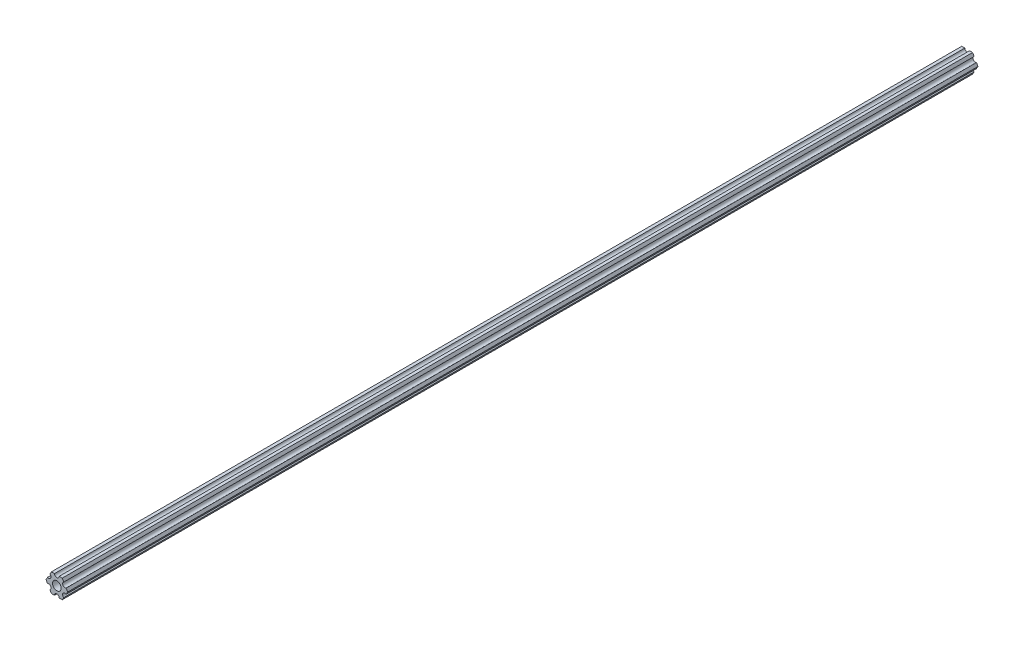
ISO-10303-21;
HEADER;
FILE_DESCRIPTION(('STEP AP214'),'2;1');
FILE_NAME('part.step','',(''),(''),'','','');
FILE_SCHEMA(('AUTOMOTIVE_DESIGN { 1 0 10303 214 1 1 1 1 }'));
ENDSEC;
DATA;
#1=APPLICATION_CONTEXT('core data for automotive mechanical design processes');
#2=APPLICATION_PROTOCOL_DEFINITION('international standard','automotive_design',2000,#1);
#3=PRODUCT_CONTEXT('',#1,'mechanical');
#4=PRODUCT('Part','Part','',(#3));
#5=PRODUCT_RELATED_PRODUCT_CATEGORY('part','',(#4));
#6=PRODUCT_DEFINITION_FORMATION('','',#4);
#7=PRODUCT_DEFINITION_CONTEXT('part definition',#1,'design');
#8=PRODUCT_DEFINITION('design','',#6,#7);
#9=PRODUCT_DEFINITION_SHAPE('','',#8);
#10=(LENGTH_UNIT() NAMED_UNIT(*) SI_UNIT(.MILLI.,.METRE.));
#11=(NAMED_UNIT(*) PLANE_ANGLE_UNIT() SI_UNIT($,.RADIAN.));
#12=(NAMED_UNIT(*) SI_UNIT($,.STERADIAN.) SOLID_ANGLE_UNIT());
#13=UNCERTAINTY_MEASURE_WITH_UNIT(LENGTH_MEASURE(1.E-05),#10,'distance_accuracy_value','');
#14=(GEOMETRIC_REPRESENTATION_CONTEXT(3) GLOBAL_UNCERTAINTY_ASSIGNED_CONTEXT((#13)) GLOBAL_UNIT_ASSIGNED_CONTEXT((#10,
#11,#12)) REPRESENTATION_CONTEXT('',''));
#15=CARTESIAN_POINT('',(0.,0.,0.));
#16=DIRECTION('',(0.,0.,1.));
#17=DIRECTION('',(1.,0.,0.));
#18=AXIS2_PLACEMENT_3D('',#15,#16,#17);
#19=CARTESIAN_POINT('',(1.58750000000001,-6.34999997712759,-615.95));
#20=DIRECTION('',(0.,-1.,0.));
#21=DIRECTION('',(0.,0.,-1.));
#22=AXIS2_PLACEMENT_3D('',#19,#20,#21);
#23=PLANE('',#22);
#24=DIRECTION('',(1.,0.,0.));
#25=VECTOR('',#24,1.);
#26=CARTESIAN_POINT('',(1.58750000000001,-6.34999997712759,0.));
#27=LINE('',#26,#25);
#28=CARTESIAN_POINT('',(1.58750000000001,-6.34999997712759,0.));
#29=VERTEX_POINT('',#28);
#30=CARTESIAN_POINT('',(3.66617417619055,-6.34999997712759,0.));
#31=VERTEX_POINT('',#30);
#32=EDGE_CURVE('E189',#29,#31,#27,.T.);
#33=ORIENTED_EDGE('',*,*,#32,.F.);
#34=DIRECTION('',(0.,0.,1.));
#35=VECTOR('',#34,1.);
#36=CARTESIAN_POINT('',(1.58750000000001,-6.34999997712759,-615.95));
#37=LINE('',#36,#35);
#38=CARTESIAN_POINT('',(1.58750000000001,-6.34999997712759,-615.95));
#39=VERTEX_POINT('',#38);
#40=EDGE_CURVE('E11',#39,#29,#37,.T.);
#41=ORIENTED_EDGE('',*,*,#40,.F.);
#42=DIRECTION('',(1.,0.,0.));
#43=VECTOR('',#42,1.);
#44=CARTESIAN_POINT('',(1.58750000000001,-6.34999997712759,-615.95));
#45=LINE('',#44,#43);
#46=CARTESIAN_POINT('',(3.66617417619055,-6.34999997712759,-615.95));
#47=VERTEX_POINT('',#46);
#48=EDGE_CURVE('E240',#39,#47,#45,.T.);
#49=ORIENTED_EDGE('',*,*,#48,.T.);
#50=DIRECTION('',(0.,0.,1.));
#51=VECTOR('',#50,1.);
#52=CARTESIAN_POINT('',(3.66617417619055,-6.34999997712759,-615.95));
#53=LINE('',#52,#51);
#54=EDGE_CURVE('E35',#47,#31,#53,.T.);
#55=ORIENTED_EDGE('',*,*,#54,.T.);
#56=EDGE_LOOP('',(#33,#41,#49,#55));
#57=FACE_BOUND('',#56,.T.);
#58=ADVANCED_FACE('F32',(#57),#23,.T.);
#59=CARTESIAN_POINT('',(0.,-6.34999997712759,-615.95));
#60=DIRECTION('',(0.,0.,1.));
#61=DIRECTION('',(1.,0.,0.));
#62=AXIS2_PLACEMENT_3D('',#59,#60,#61);
#63=CYLINDRICAL_SURFACE('',#62,1.58750000000001);
#64=CARTESIAN_POINT('',(0.,-6.34999997712759,0.));
#65=DIRECTION('',(0.,0.,-1.));
#66=DIRECTION('',(-1.,0.,0.));
#67=AXIS2_PLACEMENT_3D('',#64,#65,#66);
#68=CIRCLE('',#67,1.58750000000001);
#69=CARTESIAN_POINT('',(-1.58750000000001,-6.34999997712759,0.));
#70=VERTEX_POINT('',#69);
#71=EDGE_CURVE('E238',#70,#29,#68,.T.);
#72=ORIENTED_EDGE('',*,*,#71,.F.);
#73=DIRECTION('',(0.,0.,1.));
#74=VECTOR('',#73,1.);
#75=CARTESIAN_POINT('',(-1.58750000000001,-6.34999997712759,-615.95));
#76=LINE('',#75,#74);
#77=CARTESIAN_POINT('',(-1.58750000000001,-6.34999997712759,-615.95));
#78=VERTEX_POINT('',#77);
#79=EDGE_CURVE('E41',#78,#70,#76,.T.);
#80=ORIENTED_EDGE('',*,*,#79,.F.);
#81=CARTESIAN_POINT('',(0.,-6.34999997712759,-615.95));
#82=DIRECTION('',(0.,0.,-1.));
#83=DIRECTION('',(-1.,0.,0.));
#84=AXIS2_PLACEMENT_3D('',#81,#82,#83);
#85=CIRCLE('',#84,1.58750000000001);
#86=EDGE_CURVE('E179',#78,#39,#85,.T.);
#87=ORIENTED_EDGE('',*,*,#86,.T.);
#88=ORIENTED_EDGE('',*,*,#40,.T.);
#89=EDGE_LOOP('',(#72,#80,#87,#88));
#90=FACE_BOUND('',#89,.T.);
#91=ADVANCED_FACE('F272',(#90),#63,.F.);
#92=CARTESIAN_POINT('',(-3.66617417619055,-6.34999997712759,-615.95));
#93=DIRECTION('',(0.,-1.,0.));
#94=DIRECTION('',(0.,0.,-1.));
#95=AXIS2_PLACEMENT_3D('',#92,#93,#94);
#96=PLANE('',#95);
#97=DIRECTION('',(1.,0.,0.));
#98=VECTOR('',#97,1.);
#99=CARTESIAN_POINT('',(-3.66617417619055,-6.34999997712759,0.));
#100=LINE('',#99,#98);
#101=CARTESIAN_POINT('',(-3.66617417619055,-6.34999997712759,0.));
#102=VERTEX_POINT('',#101);
#103=EDGE_CURVE('E166',#102,#70,#100,.T.);
#104=ORIENTED_EDGE('',*,*,#103,.F.);
#105=DIRECTION('',(0.,0.,1.));
#106=VECTOR('',#105,1.);
#107=CARTESIAN_POINT('',(-3.66617417619055,-6.34999997712759,-615.95));
#108=LINE('',#107,#106);
#109=CARTESIAN_POINT('',(-3.66617417619055,-6.34999997712759,-615.95));
#110=VERTEX_POINT('',#109);
#111=EDGE_CURVE('E161',#110,#102,#108,.T.);
#112=ORIENTED_EDGE('',*,*,#111,.F.);
#113=DIRECTION('',(1.,0.,0.));
#114=VECTOR('',#113,1.);
#115=CARTESIAN_POINT('',(-3.66617417619055,-6.34999997712759,-615.95));
#116=LINE('',#115,#114);
#117=EDGE_CURVE('E164',#110,#78,#116,.T.);
#118=ORIENTED_EDGE('',*,*,#117,.T.);
#119=ORIENTED_EDGE('',*,*,#79,.T.);
#120=EDGE_LOOP('',(#104,#112,#118,#119));
#121=FACE_BOUND('',#120,.T.);
#122=ADVANCED_FACE('F163',(#121),#96,.T.);
#123=CARTESIAN_POINT('',(-4.70551124731177,-4.54981532455591,-615.95));
#124=DIRECTION('',(-0.866025408498969,-0.499999991834193,0.));
#125=DIRECTION('',(0.499999991834193,-0.866025408498969,0.));
#126=AXIS2_PLACEMENT_3D('',#123,#124,#125);
#127=PLANE('',#126);
#128=DIRECTION('',(0.499999991834193,-0.866025408498969,0.));
#129=VECTOR('',#128,1.);
#130=CARTESIAN_POINT('',(-4.70551124731177,-4.54981532455591,0.));
#131=LINE('',#130,#129);
#132=CARTESIAN_POINT('',(-4.70551124731177,-4.54981532455591,0.));
#133=VERTEX_POINT('',#132);
#134=EDGE_CURVE('E235',#133,#102,#131,.T.);
#135=ORIENTED_EDGE('',*,*,#134,.F.);
#136=DIRECTION('',(0.,0.,1.));
#137=VECTOR('',#136,1.);
#138=CARTESIAN_POINT('',(-4.70551124731177,-4.54981532455591,-615.95));
#139=LINE('',#138,#137);
#140=CARTESIAN_POINT('',(-4.70551124731177,-4.54981532455591,-615.95));
#141=VERTEX_POINT('',#140);
#142=EDGE_CURVE('E171',#141,#133,#139,.T.);
#143=ORIENTED_EDGE('',*,*,#142,.F.);
#144=DIRECTION('',(0.499999991834193,-0.866025408498969,0.));
#145=VECTOR('',#144,1.);
#146=CARTESIAN_POINT('',(-4.70551124731177,-4.54981532455591,-615.95));
#147=LINE('',#146,#145);
#148=EDGE_CURVE('E177',#141,#110,#147,.T.);
#149=ORIENTED_EDGE('',*,*,#148,.T.);
#150=ORIENTED_EDGE('',*,*,#111,.T.);
#151=EDGE_LOOP('',(#135,#143,#149,#150));
#152=FACE_BOUND('',#151,.T.);
#153=ADVANCED_FACE('F181',(#152),#127,.T.);
#154=CARTESIAN_POINT('',(-5.49926123434856,-3.17499998856379,-615.95));
#155=DIRECTION('',(0.,0.,1.));
#156=DIRECTION('',(1.,0.,0.));
#157=AXIS2_PLACEMENT_3D('',#154,#155,#156);
#158=CYLINDRICAL_SURFACE('',#157,1.58750000000001);
#159=CARTESIAN_POINT('',(-5.49926123434856,-3.17499998856379,0.));
#160=DIRECTION('',(0.,0.,-1.));
#161=DIRECTION('',(-1.,0.,0.));
#162=AXIS2_PLACEMENT_3D('',#159,#160,#161);
#163=CIRCLE('',#162,1.58750000000001);
#164=CARTESIAN_POINT('',(-6.29301122138534,-1.80018465257167,0.));
#165=VERTEX_POINT('',#164);
#166=EDGE_CURVE('E232',#165,#133,#163,.T.);
#167=ORIENTED_EDGE('',*,*,#166,.F.);
#168=DIRECTION('',(0.,0.,1.));
#169=VECTOR('',#168,1.);
#170=CARTESIAN_POINT('',(-6.29301122138534,-1.80018465257167,-615.95));
#171=LINE('',#170,#169);
#172=CARTESIAN_POINT('',(-6.29301122138534,-1.80018465257167,-615.95));
#173=VERTEX_POINT('',#172);
#174=EDGE_CURVE('E244',#173,#165,#171,.T.);
#175=ORIENTED_EDGE('',*,*,#174,.F.);
#176=CARTESIAN_POINT('',(-5.49926123434856,-3.17499998856379,-615.95));
#177=DIRECTION('',(0.,0.,-1.));
#178=DIRECTION('',(-1.,0.,0.));
#179=AXIS2_PLACEMENT_3D('',#176,#177,#178);
#180=CIRCLE('',#179,1.58750000000001);
#181=EDGE_CURVE('E182',#173,#141,#180,.T.);
#182=ORIENTED_EDGE('',*,*,#181,.T.);
#183=ORIENTED_EDGE('',*,*,#142,.T.);
#184=EDGE_LOOP('',(#167,#175,#182,#183));
#185=FACE_BOUND('',#184,.T.);
#186=ADVANCED_FACE('F285',(#185),#158,.F.);
#187=CARTESIAN_POINT('',(-7.33234829250656,0.,-615.95));
#188=DIRECTION('',(-0.866025408498969,-0.499999991834193,0.));
#189=DIRECTION('',(0.499999991834193,-0.866025408498969,0.));
#190=AXIS2_PLACEMENT_3D('',#187,#188,#189);
#191=PLANE('',#190);
#192=DIRECTION('',(0.499999991834193,-0.866025408498969,0.));
#193=VECTOR('',#192,1.);
#194=CARTESIAN_POINT('',(-7.33234829250656,0.,0.));
#195=LINE('',#194,#193);
#196=CARTESIAN_POINT('',(-7.33234829250656,0.,0.));
#197=VERTEX_POINT('',#196);
#198=EDGE_CURVE('E229',#197,#165,#195,.T.);
#199=ORIENTED_EDGE('',*,*,#198,.F.);
#200=DIRECTION('',(0.,0.,1.));
#201=VECTOR('',#200,1.);
#202=CARTESIAN_POINT('',(-7.33234829250656,0.,-615.95));
#203=LINE('',#202,#201);
#204=CARTESIAN_POINT('',(-7.33234829250656,0.,-615.95));
#205=VERTEX_POINT('',#204);
#206=EDGE_CURVE('E246',#205,#197,#203,.T.);
#207=ORIENTED_EDGE('',*,*,#206,.F.);
#208=DIRECTION('',(0.499999991834193,-0.866025408498969,0.));
#209=VECTOR('',#208,1.);
#210=CARTESIAN_POINT('',(-7.33234829250656,0.,-615.95));
#211=LINE('',#210,#209);
#212=EDGE_CURVE('E184',#205,#173,#211,.T.);
#213=ORIENTED_EDGE('',*,*,#212,.T.);
#214=ORIENTED_EDGE('',*,*,#174,.T.);
#215=EDGE_LOOP('',(#199,#207,#213,#214));
#216=FACE_BOUND('',#215,.T.);
#217=ADVANCED_FACE('F288',(#216),#191,.T.);
#218=CARTESIAN_POINT('',(-6.29301122138534,1.80018465257168,-615.95));
#219=DIRECTION('',(-0.86602540849897,0.499999991834193,0.));
#220=DIRECTION('',(-0.499999991834193,-0.86602540849897,0.));
#221=AXIS2_PLACEMENT_3D('',#218,#219,#220);
#222=PLANE('',#221);
#223=DIRECTION('',(-0.499999991834193,-0.866025408498969,0.));
#224=VECTOR('',#223,1.);
#225=CARTESIAN_POINT('',(-6.29301122138534,1.80018465257168,0.));
#226=LINE('',#225,#224);
#227=CARTESIAN_POINT('',(-6.29301122138534,1.80018465257168,0.));
#228=VERTEX_POINT('',#227);
#229=EDGE_CURVE('E226',#228,#197,#226,.T.);
#230=ORIENTED_EDGE('',*,*,#229,.F.);
#231=DIRECTION('',(0.,0.,1.));
#232=VECTOR('',#231,1.);
#233=CARTESIAN_POINT('',(-6.29301122138534,1.80018465257168,-615.95));
#234=LINE('',#233,#232);
#235=CARTESIAN_POINT('',(-6.29301122138534,1.80018465257168,-615.95));
#236=VERTEX_POINT('',#235);
#237=EDGE_CURVE('E248',#236,#228,#234,.T.);
#238=ORIENTED_EDGE('',*,*,#237,.F.);
#239=DIRECTION('',(-0.499999991834193,-0.866025408498969,0.));
#240=VECTOR('',#239,1.);
#241=CARTESIAN_POINT('',(-6.29301122138534,1.80018465257168,-615.95));
#242=LINE('',#241,#240);
#243=EDGE_CURVE('E393',#236,#205,#242,.T.);
#244=ORIENTED_EDGE('',*,*,#243,.T.);
#245=ORIENTED_EDGE('',*,*,#206,.T.);
#246=EDGE_LOOP('',(#230,#238,#244,#245));
#247=FACE_BOUND('',#246,.T.);
#248=ADVANCED_FACE('F292',(#247),#222,.T.);
#249=CARTESIAN_POINT('',(-5.49926123434856,3.1749999885638,-615.95));
#250=DIRECTION('',(0.,0.,1.));
#251=DIRECTION('',(1.,0.,0.));
#252=AXIS2_PLACEMENT_3D('',#249,#250,#251);
#253=CYLINDRICAL_SURFACE('',#252,1.58750000000001);
#254=CARTESIAN_POINT('',(-5.49926123434856,3.1749999885638,0.));
#255=DIRECTION('',(0.,0.,-1.));
#256=DIRECTION('',(-1.,0.,0.));
#257=AXIS2_PLACEMENT_3D('',#254,#255,#256);
#258=CIRCLE('',#257,1.58750000000001);
#259=CARTESIAN_POINT('',(-4.70551124731177,4.54981532455591,0.));
#260=VERTEX_POINT('',#259);
#261=EDGE_CURVE('E223',#260,#228,#258,.T.);
#262=ORIENTED_EDGE('',*,*,#261,.F.);
#263=DIRECTION('',(0.,0.,1.));
#264=VECTOR('',#263,1.);
#265=CARTESIAN_POINT('',(-4.70551124731177,4.54981532455591,-615.95));
#266=LINE('',#265,#264);
#267=CARTESIAN_POINT('',(-4.70551124731177,4.54981532455591,-615.95));
#268=VERTEX_POINT('',#267);
#269=EDGE_CURVE('E250',#268,#260,#266,.T.);
#270=ORIENTED_EDGE('',*,*,#269,.F.);
#271=CARTESIAN_POINT('',(-5.49926123434856,3.1749999885638,-615.95));
#272=DIRECTION('',(0.,0.,-1.));
#273=DIRECTION('',(-1.,0.,0.));
#274=AXIS2_PLACEMENT_3D('',#271,#272,#273);
#275=CIRCLE('',#274,1.58750000000001);
#276=EDGE_CURVE('E390',#268,#236,#275,.T.);
#277=ORIENTED_EDGE('',*,*,#276,.T.);
#278=ORIENTED_EDGE('',*,*,#237,.T.);
#279=EDGE_LOOP('',(#262,#270,#277,#278));
#280=FACE_BOUND('',#279,.T.);
#281=ADVANCED_FACE('F296',(#280),#253,.F.);
#282=CARTESIAN_POINT('',(-3.66617417619055,6.34999997712759,-615.95));
#283=DIRECTION('',(-0.866025408498969,0.499999991834193,0.));
#284=DIRECTION('',(-0.499999991834193,-0.86602540849897,0.));
#285=AXIS2_PLACEMENT_3D('',#282,#283,#284);
#286=PLANE('',#285);
#287=DIRECTION('',(-0.499999991834193,-0.866025408498969,0.));
#288=VECTOR('',#287,1.);
#289=CARTESIAN_POINT('',(-3.66617417619055,6.34999997712759,0.));
#290=LINE('',#289,#288);
#291=CARTESIAN_POINT('',(-3.66617417619055,6.34999997712759,0.));
#292=VERTEX_POINT('',#291);
#293=EDGE_CURVE('E220',#292,#260,#290,.T.);
#294=ORIENTED_EDGE('',*,*,#293,.F.);
#295=DIRECTION('',(0.,0.,1.));
#296=VECTOR('',#295,1.);
#297=CARTESIAN_POINT('',(-3.66617417619055,6.34999997712759,-615.95));
#298=LINE('',#297,#296);
#299=CARTESIAN_POINT('',(-3.66617417619055,6.34999997712759,-615.95));
#300=VERTEX_POINT('',#299);
#301=EDGE_CURVE('E252',#300,#292,#298,.T.);
#302=ORIENTED_EDGE('',*,*,#301,.F.);
#303=DIRECTION('',(-0.499999991834193,-0.866025408498969,0.));
#304=VECTOR('',#303,1.);
#305=CARTESIAN_POINT('',(-3.66617417619055,6.34999997712759,-615.95));
#306=LINE('',#305,#304);
#307=EDGE_CURVE('E387',#300,#268,#306,.T.);
#308=ORIENTED_EDGE('',*,*,#307,.T.);
#309=ORIENTED_EDGE('',*,*,#269,.T.);
#310=EDGE_LOOP('',(#294,#302,#308,#309));
#311=FACE_BOUND('',#310,.T.);
#312=ADVANCED_FACE('F300',(#311),#286,.T.);
#313=CARTESIAN_POINT('',(-1.58750000000001,6.34999997712759,-615.95));
#314=DIRECTION('',(0.,1.,0.));
#315=DIRECTION('',(0.,0.,1.));
#316=AXIS2_PLACEMENT_3D('',#313,#314,#315);
#317=PLANE('',#316);
#318=DIRECTION('',(-1.,0.,0.));
#319=VECTOR('',#318,1.);
#320=CARTESIAN_POINT('',(-1.58750000000001,6.34999997712759,0.));
#321=LINE('',#320,#319);
#322=CARTESIAN_POINT('',(-1.58750000000001,6.34999997712759,0.));
#323=VERTEX_POINT('',#322);
#324=EDGE_CURVE('E217',#323,#292,#321,.T.);
#325=ORIENTED_EDGE('',*,*,#324,.F.);
#326=DIRECTION('',(0.,0.,1.));
#327=VECTOR('',#326,1.);
#328=CARTESIAN_POINT('',(-1.58750000000001,6.34999997712759,-615.95));
#329=LINE('',#328,#327);
#330=CARTESIAN_POINT('',(-1.58750000000001,6.34999997712759,-615.95));
#331=VERTEX_POINT('',#330);
#332=EDGE_CURVE('E254',#331,#323,#329,.T.);
#333=ORIENTED_EDGE('',*,*,#332,.F.);
#334=DIRECTION('',(-1.,0.,0.));
#335=VECTOR('',#334,1.);
#336=CARTESIAN_POINT('',(-1.58750000000001,6.34999997712759,-615.95));
#337=LINE('',#336,#335);
#338=EDGE_CURVE('E384',#331,#300,#337,.T.);
#339=ORIENTED_EDGE('',*,*,#338,.T.);
#340=ORIENTED_EDGE('',*,*,#301,.T.);
#341=EDGE_LOOP('',(#325,#333,#339,#340));
#342=FACE_BOUND('',#341,.T.);
#343=ADVANCED_FACE('F304',(#342),#317,.T.);
#344=CARTESIAN_POINT('',(0.,6.34999997712759,-615.95));
#345=DIRECTION('',(0.,0.,1.));
#346=DIRECTION('',(1.,0.,0.));
#347=AXIS2_PLACEMENT_3D('',#344,#345,#346);
#348=CYLINDRICAL_SURFACE('',#347,1.58750000000001);
#349=CARTESIAN_POINT('',(0.,6.34999997712759,0.));
#350=DIRECTION('',(0.,0.,-1.));
#351=DIRECTION('',(-1.,0.,0.));
#352=AXIS2_PLACEMENT_3D('',#349,#350,#351);
#353=CIRCLE('',#352,1.58750000000001);
#354=CARTESIAN_POINT('',(1.58750000000001,6.34999997712759,0.));
#355=VERTEX_POINT('',#354);
#356=EDGE_CURVE('E214',#355,#323,#353,.T.);
#357=ORIENTED_EDGE('',*,*,#356,.F.);
#358=DIRECTION('',(0.,0.,1.));
#359=VECTOR('',#358,1.);
#360=CARTESIAN_POINT('',(1.58750000000001,6.34999997712759,-615.95));
#361=LINE('',#360,#359);
#362=CARTESIAN_POINT('',(1.58750000000001,6.34999997712759,-615.95));
#363=VERTEX_POINT('',#362);
#364=EDGE_CURVE('E256',#363,#355,#361,.T.);
#365=ORIENTED_EDGE('',*,*,#364,.F.);
#366=CARTESIAN_POINT('',(0.,6.34999997712759,-615.95));
#367=DIRECTION('',(0.,0.,-1.));
#368=DIRECTION('',(-1.,0.,0.));
#369=AXIS2_PLACEMENT_3D('',#366,#367,#368);
#370=CIRCLE('',#369,1.58750000000001);
#371=EDGE_CURVE('E381',#363,#331,#370,.T.);
#372=ORIENTED_EDGE('',*,*,#371,.T.);
#373=ORIENTED_EDGE('',*,*,#332,.T.);
#374=EDGE_LOOP('',(#357,#365,#372,#373));
#375=FACE_BOUND('',#374,.T.);
#376=ADVANCED_FACE('F308',(#375),#348,.F.);
#377=CARTESIAN_POINT('',(3.66617417619055,6.34999997712759,-615.95));
#378=DIRECTION('',(0.,1.,0.));
#379=DIRECTION('',(0.,0.,1.));
#380=AXIS2_PLACEMENT_3D('',#377,#378,#379);
#381=PLANE('',#380);
#382=DIRECTION('',(-1.,0.,0.));
#383=VECTOR('',#382,1.);
#384=CARTESIAN_POINT('',(3.66617417619055,6.34999997712759,0.));
#385=LINE('',#384,#383);
#386=CARTESIAN_POINT('',(3.66617417619055,6.34999997712759,0.));
#387=VERTEX_POINT('',#386);
#388=EDGE_CURVE('E211',#387,#355,#385,.T.);
#389=ORIENTED_EDGE('',*,*,#388,.F.);
#390=DIRECTION('',(0.,0.,1.));
#391=VECTOR('',#390,1.);
#392=CARTESIAN_POINT('',(3.66617417619055,6.34999997712759,-615.95));
#393=LINE('',#392,#391);
#394=CARTESIAN_POINT('',(3.66617417619055,6.34999997712759,-615.95));
#395=VERTEX_POINT('',#394);
#396=EDGE_CURVE('E258',#395,#387,#393,.T.);
#397=ORIENTED_EDGE('',*,*,#396,.F.);
#398=DIRECTION('',(-1.,0.,0.));
#399=VECTOR('',#398,1.);
#400=CARTESIAN_POINT('',(3.66617417619055,6.34999997712759,-615.95));
#401=LINE('',#400,#399);
#402=EDGE_CURVE('E378',#395,#363,#401,.T.);
#403=ORIENTED_EDGE('',*,*,#402,.T.);
#404=ORIENTED_EDGE('',*,*,#364,.T.);
#405=EDGE_LOOP('',(#389,#397,#403,#404));
#406=FACE_BOUND('',#405,.T.);
#407=ADVANCED_FACE('F312',(#406),#381,.T.);
#408=CARTESIAN_POINT('',(4.70551124731177,4.54981532455591,-615.95));
#409=DIRECTION('',(0.866025408498969,0.499999991834193,0.));
#410=DIRECTION('',(-0.499999991834193,0.86602540849897,0.));
#411=AXIS2_PLACEMENT_3D('',#408,#409,#410);
#412=PLANE('',#411);
#413=DIRECTION('',(-0.499999991834193,0.866025408498969,0.));
#414=VECTOR('',#413,1.);
#415=CARTESIAN_POINT('',(4.70551124731177,4.54981532455591,0.));
#416=LINE('',#415,#414);
#417=CARTESIAN_POINT('',(4.70551124731177,4.54981532455591,0.));
#418=VERTEX_POINT('',#417);
#419=EDGE_CURVE('E208',#418,#387,#416,.T.);
#420=ORIENTED_EDGE('',*,*,#419,.F.);
#421=DIRECTION('',(0.,0.,1.));
#422=VECTOR('',#421,1.);
#423=CARTESIAN_POINT('',(4.70551124731177,4.54981532455591,-615.95));
#424=LINE('',#423,#422);
#425=CARTESIAN_POINT('',(4.70551124731177,4.54981532455591,-615.95));
#426=VERTEX_POINT('',#425);
#427=EDGE_CURVE('E260',#426,#418,#424,.T.);
#428=ORIENTED_EDGE('',*,*,#427,.F.);
#429=DIRECTION('',(-0.499999991834193,0.866025408498969,0.));
#430=VECTOR('',#429,1.);
#431=CARTESIAN_POINT('',(4.70551124731177,4.54981532455591,-615.95));
#432=LINE('',#431,#430);
#433=EDGE_CURVE('E375',#426,#395,#432,.T.);
#434=ORIENTED_EDGE('',*,*,#433,.T.);
#435=ORIENTED_EDGE('',*,*,#396,.T.);
#436=EDGE_LOOP('',(#420,#428,#434,#435));
#437=FACE_BOUND('',#436,.T.);
#438=ADVANCED_FACE('F316',(#437),#412,.T.);
#439=CARTESIAN_POINT('',(5.49926123434856,3.1749999885638,-615.95));
#440=DIRECTION('',(0.,0.,1.));
#441=DIRECTION('',(1.,0.,0.));
#442=AXIS2_PLACEMENT_3D('',#439,#440,#441);
#443=CYLINDRICAL_SURFACE('',#442,1.58750000000001);
#444=CARTESIAN_POINT('',(5.49926123434856,3.1749999885638,0.));
#445=DIRECTION('',(0.,0.,-1.));
#446=DIRECTION('',(-1.,0.,0.));
#447=AXIS2_PLACEMENT_3D('',#444,#445,#446);
#448=CIRCLE('',#447,1.58750000000001);
#449=CARTESIAN_POINT('',(6.29301122138534,1.80018465257168,0.));
#450=VERTEX_POINT('',#449);
#451=EDGE_CURVE('E205',#450,#418,#448,.T.);
#452=ORIENTED_EDGE('',*,*,#451,.F.);
#453=DIRECTION('',(0.,0.,1.));
#454=VECTOR('',#453,1.);
#455=CARTESIAN_POINT('',(6.29301122138534,1.80018465257168,-615.95));
#456=LINE('',#455,#454);
#457=CARTESIAN_POINT('',(6.29301122138534,1.80018465257168,-615.95));
#458=VERTEX_POINT('',#457);
#459=EDGE_CURVE('E262',#458,#450,#456,.T.);
#460=ORIENTED_EDGE('',*,*,#459,.F.);
#461=CARTESIAN_POINT('',(5.49926123434856,3.1749999885638,-615.95));
#462=DIRECTION('',(0.,0.,-1.));
#463=DIRECTION('',(-1.,0.,0.));
#464=AXIS2_PLACEMENT_3D('',#461,#462,#463);
#465=CIRCLE('',#464,1.58750000000001);
#466=EDGE_CURVE('E372',#458,#426,#465,.T.);
#467=ORIENTED_EDGE('',*,*,#466,.T.);
#468=ORIENTED_EDGE('',*,*,#427,.T.);
#469=EDGE_LOOP('',(#452,#460,#467,#468));
#470=FACE_BOUND('',#469,.T.);
#471=ADVANCED_FACE('F320',(#470),#443,.F.);
#472=CARTESIAN_POINT('',(7.33234829250656,0.,-615.95));
#473=DIRECTION('',(0.86602540849897,0.499999991834193,0.));
#474=DIRECTION('',(-0.499999991834193,0.86602540849897,0.));
#475=AXIS2_PLACEMENT_3D('',#472,#473,#474);
#476=PLANE('',#475);
#477=DIRECTION('',(-0.499999991834193,0.866025408498969,0.));
#478=VECTOR('',#477,1.);
#479=CARTESIAN_POINT('',(7.33234829250656,0.,0.));
#480=LINE('',#479,#478);
#481=CARTESIAN_POINT('',(7.33234829250656,0.,0.));
#482=VERTEX_POINT('',#481);
#483=EDGE_CURVE('E202',#482,#450,#480,.T.);
#484=ORIENTED_EDGE('',*,*,#483,.F.);
#485=DIRECTION('',(0.,0.,1.));
#486=VECTOR('',#485,1.);
#487=CARTESIAN_POINT('',(7.33234829250656,0.,-615.95));
#488=LINE('',#487,#486);
#489=CARTESIAN_POINT('',(7.33234829250656,0.,-615.95));
#490=VERTEX_POINT('',#489);
#491=EDGE_CURVE('E264',#490,#482,#488,.T.);
#492=ORIENTED_EDGE('',*,*,#491,.F.);
#493=DIRECTION('',(-0.499999991834193,0.866025408498969,0.));
#494=VECTOR('',#493,1.);
#495=CARTESIAN_POINT('',(7.33234829250656,0.,-615.95));
#496=LINE('',#495,#494);
#497=EDGE_CURVE('E369',#490,#458,#496,.T.);
#498=ORIENTED_EDGE('',*,*,#497,.T.);
#499=ORIENTED_EDGE('',*,*,#459,.T.);
#500=EDGE_LOOP('',(#484,#492,#498,#499));
#501=FACE_BOUND('',#500,.T.);
#502=ADVANCED_FACE('F324',(#501),#476,.T.);
#503=CARTESIAN_POINT('',(6.29301122138534,-1.80018465257167,-615.95));
#504=DIRECTION('',(0.866025408498969,-0.499999991834193,0.));
#505=DIRECTION('',(0.499999991834193,0.866025408498969,0.));
#506=AXIS2_PLACEMENT_3D('',#503,#504,#505);
#507=PLANE('',#506);
#508=DIRECTION('',(0.499999991834193,0.866025408498969,0.));
#509=VECTOR('',#508,1.);
#510=CARTESIAN_POINT('',(6.29301122138534,-1.80018465257167,0.));
#511=LINE('',#510,#509);
#512=CARTESIAN_POINT('',(6.29301122138534,-1.80018465257168,0.));
#513=VERTEX_POINT('',#512);
#514=EDGE_CURVE('E199',#513,#482,#511,.T.);
#515=ORIENTED_EDGE('',*,*,#514,.F.);
#516=DIRECTION('',(0.,0.,1.));
#517=VECTOR('',#516,1.);
#518=CARTESIAN_POINT('',(6.29301122138534,-1.80018465257168,-615.95));
#519=LINE('',#518,#517);
#520=CARTESIAN_POINT('',(6.29301122138534,-1.80018465257168,-615.95));
#521=VERTEX_POINT('',#520);
#522=EDGE_CURVE('E266',#521,#513,#519,.T.);
#523=ORIENTED_EDGE('',*,*,#522,.F.);
#524=DIRECTION('',(0.499999991834193,0.866025408498969,0.));
#525=VECTOR('',#524,1.);
#526=CARTESIAN_POINT('',(6.29301122138534,-1.80018465257167,-615.95));
#527=LINE('',#526,#525);
#528=EDGE_CURVE('E366',#521,#490,#527,.T.);
#529=ORIENTED_EDGE('',*,*,#528,.T.);
#530=ORIENTED_EDGE('',*,*,#491,.T.);
#531=EDGE_LOOP('',(#515,#523,#529,#530));
#532=FACE_BOUND('',#531,.T.);
#533=ADVANCED_FACE('F328',(#532),#507,.T.);
#534=CARTESIAN_POINT('',(5.49926123434856,-3.17499998856379,-615.95));
#535=DIRECTION('',(0.,0.,1.));
#536=DIRECTION('',(1.,0.,0.));
#537=AXIS2_PLACEMENT_3D('',#534,#535,#536);
#538=CYLINDRICAL_SURFACE('',#537,1.58750000000001);
#539=CARTESIAN_POINT('',(5.49926123434856,-3.17499998856379,0.));
#540=DIRECTION('',(0.,0.,-1.));
#541=DIRECTION('',(-1.,0.,0.));
#542=AXIS2_PLACEMENT_3D('',#539,#540,#541);
#543=CIRCLE('',#542,1.58750000000001);
#544=CARTESIAN_POINT('',(4.70551124731177,-4.54981532455591,0.));
#545=VERTEX_POINT('',#544);
#546=EDGE_CURVE('E196',#545,#513,#543,.T.);
#547=ORIENTED_EDGE('',*,*,#546,.F.);
#548=DIRECTION('',(0.,0.,1.));
#549=VECTOR('',#548,1.);
#550=CARTESIAN_POINT('',(4.70551124731177,-4.54981532455591,-615.95));
#551=LINE('',#550,#549);
#552=CARTESIAN_POINT('',(4.70551124731177,-4.54981532455591,-615.95));
#553=VERTEX_POINT('',#552);
#554=EDGE_CURVE('E267',#553,#545,#551,.T.);
#555=ORIENTED_EDGE('',*,*,#554,.F.);
#556=CARTESIAN_POINT('',(5.49926123434856,-3.17499998856379,-615.95));
#557=DIRECTION('',(0.,0.,-1.));
#558=DIRECTION('',(-1.,0.,0.));
#559=AXIS2_PLACEMENT_3D('',#556,#557,#558);
#560=CIRCLE('',#559,1.58750000000001);
#561=EDGE_CURVE('E363',#553,#521,#560,.T.);
#562=ORIENTED_EDGE('',*,*,#561,.T.);
#563=ORIENTED_EDGE('',*,*,#522,.T.);
#564=EDGE_LOOP('',(#547,#555,#562,#563));
#565=FACE_BOUND('',#564,.T.);
#566=ADVANCED_FACE('F332',(#565),#538,.F.);
#567=CARTESIAN_POINT('',(3.66617417619055,-6.34999997712759,-615.95));
#568=DIRECTION('',(0.866025408498969,-0.499999991834193,0.));
#569=DIRECTION('',(0.499999991834193,0.866025408498969,0.));
#570=AXIS2_PLACEMENT_3D('',#567,#568,#569);
#571=PLANE('',#570);
#572=DIRECTION('',(0.499999991834193,0.866025408498969,0.));
#573=VECTOR('',#572,1.);
#574=CARTESIAN_POINT('',(3.66617417619055,-6.34999997712759,0.));
#575=LINE('',#574,#573);
#576=EDGE_CURVE('E192',#31,#545,#575,.T.);
#577=ORIENTED_EDGE('',*,*,#576,.F.);
#578=ORIENTED_EDGE('',*,*,#54,.F.);
#579=DIRECTION('',(0.499999991834193,0.866025408498969,0.));
#580=VECTOR('',#579,1.);
#581=CARTESIAN_POINT('',(3.66617417619055,-6.34999997712759,-615.95));
#582=LINE('',#581,#580);
#583=EDGE_CURVE('E361',#47,#553,#582,.T.);
#584=ORIENTED_EDGE('',*,*,#583,.T.);
#585=ORIENTED_EDGE('',*,*,#554,.T.);
#586=EDGE_LOOP('',(#577,#578,#584,#585));
#587=FACE_BOUND('',#586,.T.);
#588=ADVANCED_FACE('F269',(#587),#571,.T.);
#589=CARTESIAN_POINT('',(5.49926123434856,-3.17499998856379,-615.95));
#590=DIRECTION('',(0.,0.,-1.));
#591=DIRECTION('',(-1.,0.,0.));
#592=AXIS2_PLACEMENT_3D('',#589,#590,#591);
#593=PLANE('',#592);
#594=CARTESIAN_POINT('',(0.,0.,-615.95));
#595=DIRECTION('',(0.,0.,1.));
#596=DIRECTION('',(-1.,0.,0.));
#597=AXIS2_PLACEMENT_3D('',#594,#595,#596);
#598=CIRCLE('',#597,2.9337);
#599=CARTESIAN_POINT('',(-2.9337,0.,-615.95));
#600=VERTEX_POINT('',#599);
#601=EDGE_CURVE('E193',#600,#600,#598,.T.);
#602=ORIENTED_EDGE('',*,*,#601,.T.);
#603=EDGE_LOOP('',(#602));
#604=FACE_BOUND('',#603,.T.);
#605=ORIENTED_EDGE('',*,*,#48,.F.);
#606=ORIENTED_EDGE('',*,*,#86,.F.);
#607=ORIENTED_EDGE('',*,*,#117,.F.);
#608=ORIENTED_EDGE('',*,*,#148,.F.);
#609=ORIENTED_EDGE('',*,*,#181,.F.);
#610=ORIENTED_EDGE('',*,*,#212,.F.);
#611=ORIENTED_EDGE('',*,*,#243,.F.);
#612=ORIENTED_EDGE('',*,*,#276,.F.);
#613=ORIENTED_EDGE('',*,*,#307,.F.);
#614=ORIENTED_EDGE('',*,*,#338,.F.);
#615=ORIENTED_EDGE('',*,*,#371,.F.);
#616=ORIENTED_EDGE('',*,*,#402,.F.);
#617=ORIENTED_EDGE('',*,*,#433,.F.);
#618=ORIENTED_EDGE('',*,*,#466,.F.);
#619=ORIENTED_EDGE('',*,*,#497,.F.);
#620=ORIENTED_EDGE('',*,*,#528,.F.);
#621=ORIENTED_EDGE('',*,*,#561,.F.);
#622=ORIENTED_EDGE('',*,*,#583,.F.);
#623=EDGE_LOOP('',(#605,#606,#607,#608,#609,#610,#611,#612,#613,#614,#615,#616,#617,#618,#619,
#620,#621,#622));
#624=FACE_BOUND('',#623,.T.);
#625=ADVANCED_FACE('F175',(#604,#624),#593,.T.);
#626=CARTESIAN_POINT('',(5.49926123434856,-3.17499998856379,0.));
#627=DIRECTION('',(0.,0.,-1.));
#628=DIRECTION('',(-1.,0.,0.));
#629=AXIS2_PLACEMENT_3D('',#626,#627,#628);
#630=PLANE('',#629);
#631=CARTESIAN_POINT('',(0.,0.,0.));
#632=DIRECTION('',(0.,0.,1.));
#633=DIRECTION('',(-1.,0.,0.));
#634=AXIS2_PLACEMENT_3D('',#631,#632,#633);
#635=CIRCLE('',#634,2.9337);
#636=CARTESIAN_POINT('',(-2.9337,0.,0.));
#637=VERTEX_POINT('',#636);
#638=EDGE_CURVE('E356',#637,#637,#635,.T.);
#639=ORIENTED_EDGE('',*,*,#638,.F.);
#640=EDGE_LOOP('',(#639));
#641=FACE_BOUND('',#640,.T.);
#642=ORIENTED_EDGE('',*,*,#32,.T.);
#643=ORIENTED_EDGE('',*,*,#576,.T.);
#644=ORIENTED_EDGE('',*,*,#546,.T.);
#645=ORIENTED_EDGE('',*,*,#514,.T.);
#646=ORIENTED_EDGE('',*,*,#483,.T.);
#647=ORIENTED_EDGE('',*,*,#451,.T.);
#648=ORIENTED_EDGE('',*,*,#419,.T.);
#649=ORIENTED_EDGE('',*,*,#388,.T.);
#650=ORIENTED_EDGE('',*,*,#356,.T.);
#651=ORIENTED_EDGE('',*,*,#324,.T.);
#652=ORIENTED_EDGE('',*,*,#293,.T.);
#653=ORIENTED_EDGE('',*,*,#261,.T.);
#654=ORIENTED_EDGE('',*,*,#229,.T.);
#655=ORIENTED_EDGE('',*,*,#198,.T.);
#656=ORIENTED_EDGE('',*,*,#166,.T.);
#657=ORIENTED_EDGE('',*,*,#134,.T.);
#658=ORIENTED_EDGE('',*,*,#103,.T.);
#659=ORIENTED_EDGE('',*,*,#71,.T.);
#660=EDGE_LOOP('',(#642,#643,#644,#645,#646,#647,#648,#649,#650,#651,#652,#653,#654,#655,#656,
#657,#658,#659));
#661=FACE_BOUND('',#660,.T.);
#662=ADVANCED_FACE('F271',(#641,#661),#630,.F.);
#663=CARTESIAN_POINT('',(0.,0.,-615.95));
#664=DIRECTION('',(0.,0.,1.));
#665=DIRECTION('',(1.,0.,0.));
#666=AXIS2_PLACEMENT_3D('',#663,#664,#665);
#667=CYLINDRICAL_SURFACE('',#666,2.9337);
#668=ORIENTED_EDGE('',*,*,#601,.F.);
#669=EDGE_LOOP('',(#668));
#670=FACE_BOUND('',#669,.T.);
#671=ORIENTED_EDGE('',*,*,#638,.T.);
#672=EDGE_LOOP('',(#671));
#673=FACE_BOUND('',#672,.T.);
#674=ADVANCED_FACE('F344',(#670,#673),#667,.F.);
#675=CLOSED_SHELL('',(#58,#91,#122,#153,#186,#217,#248,#281,#312,#343,#376,#407,#438,#471,#502,
#533,#566,#588,#625,#662,#674));
#676=MANIFOLD_SOLID_BREP('B2',#675);
#677=ADVANCED_BREP_SHAPE_REPRESENTATION('',(#18,#676),#14);
#678=SHAPE_DEFINITION_REPRESENTATION(#9,#677);
ENDSEC;
END-ISO-10303-21;
